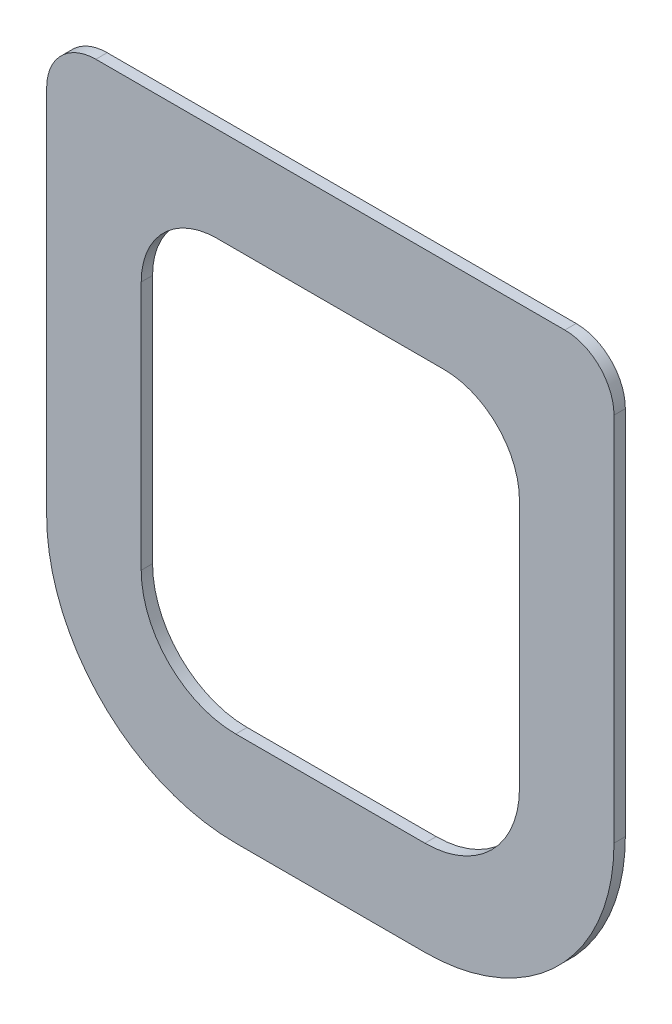
ISO-10303-21;
HEADER;
FILE_DESCRIPTION(('STEP AP214'),'2;1');
FILE_NAME('part.step','',(''),(''),'','','');
FILE_SCHEMA(('AUTOMOTIVE_DESIGN { 1 0 10303 214 1 1 1 1 }'));
ENDSEC;
DATA;
#1=APPLICATION_CONTEXT('core data for automotive mechanical design processes');
#2=APPLICATION_PROTOCOL_DEFINITION('international standard','automotive_design',2000,#1);
#3=PRODUCT_CONTEXT('',#1,'mechanical');
#4=PRODUCT('Part','Part','',(#3));
#5=PRODUCT_RELATED_PRODUCT_CATEGORY('part','',(#4));
#6=PRODUCT_DEFINITION_FORMATION('','',#4);
#7=PRODUCT_DEFINITION_CONTEXT('part definition',#1,'design');
#8=PRODUCT_DEFINITION('design','',#6,#7);
#9=PRODUCT_DEFINITION_SHAPE('','',#8);
#10=(LENGTH_UNIT() NAMED_UNIT(*) SI_UNIT(.MILLI.,.METRE.));
#11=(NAMED_UNIT(*) PLANE_ANGLE_UNIT() SI_UNIT($,.RADIAN.));
#12=(NAMED_UNIT(*) SI_UNIT($,.STERADIAN.) SOLID_ANGLE_UNIT());
#13=UNCERTAINTY_MEASURE_WITH_UNIT(LENGTH_MEASURE(1.E-05),#10,'distance_accuracy_value','');
#14=(GEOMETRIC_REPRESENTATION_CONTEXT(3) GLOBAL_UNCERTAINTY_ASSIGNED_CONTEXT((#13)) GLOBAL_UNIT_ASSIGNED_CONTEXT((#10,
#11,#12)) REPRESENTATION_CONTEXT('',''));
#15=CARTESIAN_POINT('',(0.,0.,0.));
#16=DIRECTION('',(0.,0.,1.));
#17=DIRECTION('',(1.,0.,0.));
#18=AXIS2_PLACEMENT_3D('',#15,#16,#17);
#19=CARTESIAN_POINT('',(-25.,-34.1899999999999,3.));
#20=DIRECTION('',(0.,0.,1.));
#21=DIRECTION('',(1.,0.,0.));
#22=AXIS2_PLACEMENT_3D('',#19,#20,#21);
#23=PLANE('',#22);
#24=CARTESIAN_POINT('',(-25.,-34.1899999999999,3.));
#25=DIRECTION('',(0.,0.,1.));
#26=DIRECTION('',(1.,0.,0.));
#27=AXIS2_PLACEMENT_3D('',#24,#25,#26);
#28=CIRCLE('',#27,50.);
#29=CARTESIAN_POINT('',(-75.,-34.19,3.));
#30=VERTEX_POINT('',#29);
#31=CARTESIAN_POINT('',(-25.,-84.1899999999999,3.));
#32=VERTEX_POINT('',#31);
#33=EDGE_CURVE('E198',#30,#32,#28,.T.);
#34=ORIENTED_EDGE('',*,*,#33,.T.);
#35=DIRECTION('',(1.,0.,0.));
#36=VECTOR('',#35,1.);
#37=CARTESIAN_POINT('',(-25.,-84.1899999999999,3.));
#38=LINE('',#37,#36);
#39=CARTESIAN_POINT('',(25.,-84.1899999999999,3.));
#40=VERTEX_POINT('',#39);
#41=EDGE_CURVE('E201',#32,#40,#38,.T.);
#42=ORIENTED_EDGE('',*,*,#41,.T.);
#43=CARTESIAN_POINT('',(25.,-34.19,3.));
#44=DIRECTION('',(0.,0.,1.));
#45=DIRECTION('',(1.,0.,0.));
#46=AXIS2_PLACEMENT_3D('',#43,#44,#45);
#47=CIRCLE('',#46,49.9999999999999);
#48=CARTESIAN_POINT('',(75.,-34.19,3.));
#49=VERTEX_POINT('',#48);
#50=EDGE_CURVE('E204',#40,#49,#47,.T.);
#51=ORIENTED_EDGE('',*,*,#50,.T.);
#52=DIRECTION('',(0.,1.,0.));
#53=VECTOR('',#52,1.);
#54=CARTESIAN_POINT('',(75.,-34.19,3.));
#55=LINE('',#54,#53);
#56=CARTESIAN_POINT('',(75.,63.81,3.));
#57=VERTEX_POINT('',#56);
#58=EDGE_CURVE('E206',#49,#57,#55,.T.);
#59=ORIENTED_EDGE('',*,*,#58,.T.);
#60=CARTESIAN_POINT('',(62.,63.81,3.));
#61=DIRECTION('',(0.,0.,1.));
#62=DIRECTION('',(1.,0.,0.));
#63=AXIS2_PLACEMENT_3D('',#60,#61,#62);
#64=CIRCLE('',#63,13.);
#65=CARTESIAN_POINT('',(62.,76.81,3.));
#66=VERTEX_POINT('',#65);
#67=EDGE_CURVE('E208',#57,#66,#64,.T.);
#68=ORIENTED_EDGE('',*,*,#67,.T.);
#69=DIRECTION('',(-1.,0.,0.));
#70=VECTOR('',#69,1.);
#71=CARTESIAN_POINT('',(62.,76.81,3.));
#72=LINE('',#71,#70);
#73=CARTESIAN_POINT('',(-62.,76.81,3.));
#74=VERTEX_POINT('',#73);
#75=EDGE_CURVE('E210',#66,#74,#72,.T.);
#76=ORIENTED_EDGE('',*,*,#75,.T.);
#77=CARTESIAN_POINT('',(-62.,63.81,3.));
#78=DIRECTION('',(0.,0.,1.));
#79=DIRECTION('',(-1.,0.,0.));
#80=AXIS2_PLACEMENT_3D('',#77,#78,#79);
#81=CIRCLE('',#80,13.);
#82=CARTESIAN_POINT('',(-75.,63.81,3.));
#83=VERTEX_POINT('',#82);
#84=EDGE_CURVE('E212',#74,#83,#81,.T.);
#85=ORIENTED_EDGE('',*,*,#84,.T.);
#86=DIRECTION('',(0.,-1.,0.));
#87=VECTOR('',#86,1.);
#88=CARTESIAN_POINT('',(-75.,63.81,3.));
#89=LINE('',#88,#87);
#90=EDGE_CURVE('E214',#83,#30,#89,.T.);
#91=ORIENTED_EDGE('',*,*,#90,.T.);
#92=EDGE_LOOP('',(#34,#42,#51,#59,#68,#76,#85,#91));
#93=FACE_BOUND('',#92,.T.);
#94=DIRECTION('',(-1.,0.,0.));
#95=VECTOR('',#94,1.);
#96=CARTESIAN_POINT('',(50.,51.81,3.));
#97=LINE('',#96,#95);
#98=CARTESIAN_POINT('',(30.,51.81,3.));
#99=VERTEX_POINT('',#98);
#100=CARTESIAN_POINT('',(-30.,51.81,3.));
#101=VERTEX_POINT('',#100);
#102=EDGE_CURVE('E155',#99,#101,#97,.T.);
#103=ORIENTED_EDGE('',*,*,#102,.F.);
#104=CARTESIAN_POINT('',(30.,31.81,3.));
#105=DIRECTION('',(0.,0.,1.));
#106=DIRECTION('',(1.,0.,0.));
#107=AXIS2_PLACEMENT_3D('',#104,#105,#106);
#108=CIRCLE('',#107,20.);
#109=CARTESIAN_POINT('',(50.,31.81,3.));
#110=VERTEX_POINT('',#109);
#111=EDGE_CURVE('E266',#99,#110,#108,.F.);
#112=ORIENTED_EDGE('',*,*,#111,.T.);
#113=DIRECTION('',(0.,1.,0.));
#114=VECTOR('',#113,1.);
#115=CARTESIAN_POINT('',(50.,-34.19,3.));
#116=LINE('',#115,#114);
#117=CARTESIAN_POINT('',(50.,-34.19,3.));
#118=VERTEX_POINT('',#117);
#119=EDGE_CURVE('E192',#118,#110,#116,.T.);
#120=ORIENTED_EDGE('',*,*,#119,.F.);
#121=CARTESIAN_POINT('',(25.,-34.19,3.));
#122=DIRECTION('',(0.,0.,1.));
#123=DIRECTION('',(1.,0.,0.));
#124=AXIS2_PLACEMENT_3D('',#121,#122,#123);
#125=CIRCLE('',#124,24.9999999999999);
#126=CARTESIAN_POINT('',(25.,-59.1899999999999,3.));
#127=VERTEX_POINT('',#126);
#128=EDGE_CURVE('E172',#127,#118,#125,.T.);
#129=ORIENTED_EDGE('',*,*,#128,.F.);
#130=DIRECTION('',(1.,0.,0.));
#131=VECTOR('',#130,1.);
#132=CARTESIAN_POINT('',(-25.,-59.1899999999999,3.));
#133=LINE('',#132,#131);
#134=CARTESIAN_POINT('',(-25.,-59.1899999999999,3.));
#135=VERTEX_POINT('',#134);
#136=EDGE_CURVE('E170',#135,#127,#133,.T.);
#137=ORIENTED_EDGE('',*,*,#136,.F.);
#138=CARTESIAN_POINT('',(-25.,-34.1899999999999,3.));
#139=DIRECTION('',(0.,0.,1.));
#140=DIRECTION('',(1.,0.,0.));
#141=AXIS2_PLACEMENT_3D('',#138,#139,#140);
#142=CIRCLE('',#141,25.);
#143=CARTESIAN_POINT('',(-50.,-34.19,3.));
#144=VERTEX_POINT('',#143);
#145=EDGE_CURVE('E154',#144,#135,#142,.T.);
#146=ORIENTED_EDGE('',*,*,#145,.F.);
#147=DIRECTION('',(0.,-1.,0.));
#148=VECTOR('',#147,1.);
#149=CARTESIAN_POINT('',(-50.,51.81,3.));
#150=LINE('',#149,#148);
#151=CARTESIAN_POINT('',(-50.,31.81,3.));
#152=VERTEX_POINT('',#151);
#153=EDGE_CURVE('E146',#152,#144,#150,.T.);
#154=ORIENTED_EDGE('',*,*,#153,.F.);
#155=CARTESIAN_POINT('',(-30.,31.81,3.));
#156=DIRECTION('',(0.,0.,1.));
#157=DIRECTION('',(1.,0.,0.));
#158=AXIS2_PLACEMENT_3D('',#155,#156,#157);
#159=CIRCLE('',#158,20.);
#160=EDGE_CURVE('E11',#152,#101,#159,.F.);
#161=ORIENTED_EDGE('',*,*,#160,.T.);
#162=EDGE_LOOP('',(#103,#112,#120,#129,#137,#146,#154,#161));
#163=FACE_BOUND('',#162,.T.);
#164=ADVANCED_FACE('F37',(#93,#163),#23,.T.);
#165=CARTESIAN_POINT('',(-25.,-34.1899999999999,0.));
#166=DIRECTION('',(0.,0.,1.));
#167=DIRECTION('',(1.,0.,0.));
#168=AXIS2_PLACEMENT_3D('',#165,#166,#167);
#169=PLANE('',#168);
#170=CARTESIAN_POINT('',(-25.,-34.1899999999999,0.));
#171=DIRECTION('',(0.,0.,1.));
#172=DIRECTION('',(1.,0.,0.));
#173=AXIS2_PLACEMENT_3D('',#170,#171,#172);
#174=CIRCLE('',#173,50.);
#175=CARTESIAN_POINT('',(-75.,-34.19,0.));
#176=VERTEX_POINT('',#175);
#177=CARTESIAN_POINT('',(-25.,-84.1899999999999,0.));
#178=VERTEX_POINT('',#177);
#179=EDGE_CURVE('E163',#176,#178,#174,.T.);
#180=ORIENTED_EDGE('',*,*,#179,.F.);
#181=DIRECTION('',(0.,-1.,0.));
#182=VECTOR('',#181,1.);
#183=CARTESIAN_POINT('',(-75.,63.81,0.));
#184=LINE('',#183,#182);
#185=CARTESIAN_POINT('',(-75.,63.81,0.));
#186=VERTEX_POINT('',#185);
#187=EDGE_CURVE('E202',#186,#176,#184,.T.);
#188=ORIENTED_EDGE('',*,*,#187,.F.);
#189=CARTESIAN_POINT('',(-62.,63.81,0.));
#190=DIRECTION('',(0.,0.,1.));
#191=DIRECTION('',(-1.,0.,0.));
#192=AXIS2_PLACEMENT_3D('',#189,#190,#191);
#193=CIRCLE('',#192,13.);
#194=CARTESIAN_POINT('',(-62.,76.81,0.));
#195=VERTEX_POINT('',#194);
#196=EDGE_CURVE('E229',#195,#186,#193,.T.);
#197=ORIENTED_EDGE('',*,*,#196,.F.);
#198=DIRECTION('',(-1.,0.,0.));
#199=VECTOR('',#198,1.);
#200=CARTESIAN_POINT('',(62.,76.81,0.));
#201=LINE('',#200,#199);
#202=CARTESIAN_POINT('',(62.,76.81,0.));
#203=VERTEX_POINT('',#202);
#204=EDGE_CURVE('E227',#203,#195,#201,.T.);
#205=ORIENTED_EDGE('',*,*,#204,.F.);
#206=CARTESIAN_POINT('',(62.,63.81,0.));
#207=DIRECTION('',(0.,0.,1.));
#208=DIRECTION('',(1.,0.,0.));
#209=AXIS2_PLACEMENT_3D('',#206,#207,#208);
#210=CIRCLE('',#209,13.);
#211=CARTESIAN_POINT('',(75.,63.81,0.));
#212=VERTEX_POINT('',#211);
#213=EDGE_CURVE('E225',#212,#203,#210,.T.);
#214=ORIENTED_EDGE('',*,*,#213,.F.);
#215=DIRECTION('',(0.,1.,0.));
#216=VECTOR('',#215,1.);
#217=CARTESIAN_POINT('',(75.,-34.19,0.));
#218=LINE('',#217,#216);
#219=CARTESIAN_POINT('',(75.,-34.19,0.));
#220=VERTEX_POINT('',#219);
#221=EDGE_CURVE('E223',#220,#212,#218,.T.);
#222=ORIENTED_EDGE('',*,*,#221,.F.);
#223=CARTESIAN_POINT('',(25.,-34.19,0.));
#224=DIRECTION('',(0.,0.,1.));
#225=DIRECTION('',(1.,0.,0.));
#226=AXIS2_PLACEMENT_3D('',#223,#224,#225);
#227=CIRCLE('',#226,49.9999999999999);
#228=CARTESIAN_POINT('',(25.,-84.1899999999999,0.));
#229=VERTEX_POINT('',#228);
#230=EDGE_CURVE('E221',#229,#220,#227,.T.);
#231=ORIENTED_EDGE('',*,*,#230,.F.);
#232=DIRECTION('',(1.,0.,0.));
#233=VECTOR('',#232,1.);
#234=CARTESIAN_POINT('',(0.500000000000046,-84.1899999999999,0.));
#235=LINE('',#234,#233);
#236=EDGE_CURVE('E219',#178,#229,#235,.T.);
#237=ORIENTED_EDGE('',*,*,#236,.F.);
#238=EDGE_LOOP('',(#180,#188,#197,#205,#214,#222,#231,#237));
#239=FACE_BOUND('',#238,.T.);
#240=DIRECTION('',(0.,1.,0.));
#241=VECTOR('',#240,1.);
#242=CARTESIAN_POINT('',(50.,-34.19,0.));
#243=LINE('',#242,#241);
#244=CARTESIAN_POINT('',(50.,-34.19,0.));
#245=VERTEX_POINT('',#244);
#246=CARTESIAN_POINT('',(50.,31.81,0.));
#247=VERTEX_POINT('',#246);
#248=EDGE_CURVE('E178',#245,#247,#243,.T.);
#249=ORIENTED_EDGE('',*,*,#248,.T.);
#250=CARTESIAN_POINT('',(30.,31.81,0.));
#251=DIRECTION('',(0.,0.,1.));
#252=DIRECTION('',(1.,0.,0.));
#253=AXIS2_PLACEMENT_3D('',#250,#251,#252);
#254=CIRCLE('',#253,20.);
#255=CARTESIAN_POINT('',(30.,51.81,0.));
#256=VERTEX_POINT('',#255);
#257=EDGE_CURVE('E264',#247,#256,#254,.T.);
#258=ORIENTED_EDGE('',*,*,#257,.T.);
#259=DIRECTION('',(-1.,0.,0.));
#260=VECTOR('',#259,1.);
#261=CARTESIAN_POINT('',(50.,51.81,0.));
#262=LINE('',#261,#260);
#263=CARTESIAN_POINT('',(-30.,51.81,0.));
#264=VERTEX_POINT('',#263);
#265=EDGE_CURVE('E181',#256,#264,#262,.T.);
#266=ORIENTED_EDGE('',*,*,#265,.T.);
#267=CARTESIAN_POINT('',(-30.,31.81,0.));
#268=DIRECTION('',(0.,0.,1.));
#269=DIRECTION('',(1.,0.,0.));
#270=AXIS2_PLACEMENT_3D('',#267,#268,#269);
#271=CIRCLE('',#270,20.);
#272=CARTESIAN_POINT('',(-50.,31.81,0.));
#273=VERTEX_POINT('',#272);
#274=EDGE_CURVE('E45',#264,#273,#271,.T.);
#275=ORIENTED_EDGE('',*,*,#274,.T.);
#276=DIRECTION('',(0.,-1.,0.));
#277=VECTOR('',#276,1.);
#278=CARTESIAN_POINT('',(-50.,51.81,0.));
#279=LINE('',#278,#277);
#280=CARTESIAN_POINT('',(-50.,-34.19,0.));
#281=VERTEX_POINT('',#280);
#282=EDGE_CURVE('E183',#273,#281,#279,.T.);
#283=ORIENTED_EDGE('',*,*,#282,.T.);
#284=CARTESIAN_POINT('',(-25.,-34.1899999999999,0.));
#285=DIRECTION('',(0.,0.,1.));
#286=DIRECTION('',(1.,0.,0.));
#287=AXIS2_PLACEMENT_3D('',#284,#285,#286);
#288=CIRCLE('',#287,25.);
#289=CARTESIAN_POINT('',(-25.,-59.1899999999999,0.));
#290=VERTEX_POINT('',#289);
#291=EDGE_CURVE('E162',#281,#290,#288,.T.);
#292=ORIENTED_EDGE('',*,*,#291,.T.);
#293=DIRECTION('',(1.,0.,0.));
#294=VECTOR('',#293,1.);
#295=CARTESIAN_POINT('',(0.500000000000046,-59.1899999999999,0.));
#296=LINE('',#295,#294);
#297=CARTESIAN_POINT('',(25.,-59.1899999999999,0.));
#298=VERTEX_POINT('',#297);
#299=EDGE_CURVE('E186',#290,#298,#296,.T.);
#300=ORIENTED_EDGE('',*,*,#299,.T.);
#301=CARTESIAN_POINT('',(25.,-34.19,0.));
#302=DIRECTION('',(0.,0.,1.));
#303=DIRECTION('',(1.,0.,0.));
#304=AXIS2_PLACEMENT_3D('',#301,#302,#303);
#305=CIRCLE('',#304,24.9999999999999);
#306=EDGE_CURVE('E189',#298,#245,#305,.T.);
#307=ORIENTED_EDGE('',*,*,#306,.T.);
#308=EDGE_LOOP('',(#249,#258,#266,#275,#283,#292,#300,#307));
#309=FACE_BOUND('',#308,.T.);
#310=ADVANCED_FACE('F280',(#239,#309),#169,.F.);
#311=CARTESIAN_POINT('',(-25.,-34.1899999999999,3.));
#312=DIRECTION('',(0.,0.,-1.));
#313=DIRECTION('',(-1.,0.,0.));
#314=AXIS2_PLACEMENT_3D('',#311,#312,#313);
#315=CYLINDRICAL_SURFACE('',#314,50.);
#316=ORIENTED_EDGE('',*,*,#179,.T.);
#317=DIRECTION('',(0.,0.,-1.));
#318=VECTOR('',#317,1.);
#319=CARTESIAN_POINT('',(-25.,-84.1899999999999,3.));
#320=LINE('',#319,#318);
#321=EDGE_CURVE('E252',#32,#178,#320,.T.);
#322=ORIENTED_EDGE('',*,*,#321,.F.);
#323=ORIENTED_EDGE('',*,*,#33,.F.);
#324=DIRECTION('',(0.,0.,-1.));
#325=VECTOR('',#324,1.);
#326=CARTESIAN_POINT('',(-75.,-34.19,3.));
#327=LINE('',#326,#325);
#328=EDGE_CURVE('E216',#30,#176,#327,.T.);
#329=ORIENTED_EDGE('',*,*,#328,.T.);
#330=EDGE_LOOP('',(#316,#322,#323,#329));
#331=FACE_BOUND('',#330,.T.);
#332=ADVANCED_FACE('F296',(#331),#315,.T.);
#333=CARTESIAN_POINT('',(0.500000000000046,-84.1899999999999,3.));
#334=DIRECTION('',(0.,1.,0.));
#335=DIRECTION('',(0.,0.,1.));
#336=AXIS2_PLACEMENT_3D('',#333,#334,#335);
#337=PLANE('',#336);
#338=ORIENTED_EDGE('',*,*,#236,.T.);
#339=DIRECTION('',(0.,0.,-1.));
#340=VECTOR('',#339,1.);
#341=CARTESIAN_POINT('',(25.,-84.1899999999999,3.));
#342=LINE('',#341,#340);
#343=EDGE_CURVE('E249',#40,#229,#342,.T.);
#344=ORIENTED_EDGE('',*,*,#343,.F.);
#345=ORIENTED_EDGE('',*,*,#41,.F.);
#346=ORIENTED_EDGE('',*,*,#321,.T.);
#347=EDGE_LOOP('',(#338,#344,#345,#346));
#348=FACE_BOUND('',#347,.T.);
#349=ADVANCED_FACE('F325',(#348),#337,.F.);
#350=CARTESIAN_POINT('',(25.,-34.19,3.));
#351=DIRECTION('',(0.,0.,-1.));
#352=DIRECTION('',(-1.,0.,0.));
#353=AXIS2_PLACEMENT_3D('',#350,#351,#352);
#354=CYLINDRICAL_SURFACE('',#353,49.9999999999999);
#355=ORIENTED_EDGE('',*,*,#230,.T.);
#356=DIRECTION('',(0.,0.,-1.));
#357=VECTOR('',#356,1.);
#358=CARTESIAN_POINT('',(75.,-34.19,3.));
#359=LINE('',#358,#357);
#360=EDGE_CURVE('E246',#49,#220,#359,.T.);
#361=ORIENTED_EDGE('',*,*,#360,.F.);
#362=ORIENTED_EDGE('',*,*,#50,.F.);
#363=ORIENTED_EDGE('',*,*,#343,.T.);
#364=EDGE_LOOP('',(#355,#361,#362,#363));
#365=FACE_BOUND('',#364,.T.);
#366=ADVANCED_FACE('F321',(#365),#354,.T.);
#367=CARTESIAN_POINT('',(75.,-34.19,3.));
#368=DIRECTION('',(-1.,0.,0.));
#369=DIRECTION('',(0.,0.,1.));
#370=AXIS2_PLACEMENT_3D('',#367,#368,#369);
#371=PLANE('',#370);
#372=ORIENTED_EDGE('',*,*,#221,.T.);
#373=DIRECTION('',(0.,0.,-1.));
#374=VECTOR('',#373,1.);
#375=CARTESIAN_POINT('',(75.,63.81,3.));
#376=LINE('',#375,#374);
#377=EDGE_CURVE('E243',#57,#212,#376,.T.);
#378=ORIENTED_EDGE('',*,*,#377,.F.);
#379=ORIENTED_EDGE('',*,*,#58,.F.);
#380=ORIENTED_EDGE('',*,*,#360,.T.);
#381=EDGE_LOOP('',(#372,#378,#379,#380));
#382=FACE_BOUND('',#381,.T.);
#383=ADVANCED_FACE('F317',(#382),#371,.F.);
#384=CARTESIAN_POINT('',(62.,63.81,3.));
#385=DIRECTION('',(0.,0.,-1.));
#386=DIRECTION('',(-1.,0.,0.));
#387=AXIS2_PLACEMENT_3D('',#384,#385,#386);
#388=CYLINDRICAL_SURFACE('',#387,13.);
#389=ORIENTED_EDGE('',*,*,#213,.T.);
#390=DIRECTION('',(0.,0.,-1.));
#391=VECTOR('',#390,1.);
#392=CARTESIAN_POINT('',(62.,76.81,3.));
#393=LINE('',#392,#391);
#394=EDGE_CURVE('E240',#66,#203,#393,.T.);
#395=ORIENTED_EDGE('',*,*,#394,.F.);
#396=ORIENTED_EDGE('',*,*,#67,.F.);
#397=ORIENTED_EDGE('',*,*,#377,.T.);
#398=EDGE_LOOP('',(#389,#395,#396,#397));
#399=FACE_BOUND('',#398,.T.);
#400=ADVANCED_FACE('F313',(#399),#388,.T.);
#401=CARTESIAN_POINT('',(62.,76.81,3.));
#402=DIRECTION('',(0.,-1.,0.));
#403=DIRECTION('',(0.,0.,-1.));
#404=AXIS2_PLACEMENT_3D('',#401,#402,#403);
#405=PLANE('',#404);
#406=ORIENTED_EDGE('',*,*,#204,.T.);
#407=DIRECTION('',(0.,0.,-1.));
#408=VECTOR('',#407,1.);
#409=CARTESIAN_POINT('',(-62.,76.81,3.));
#410=LINE('',#409,#408);
#411=EDGE_CURVE('E237',#74,#195,#410,.T.);
#412=ORIENTED_EDGE('',*,*,#411,.F.);
#413=ORIENTED_EDGE('',*,*,#75,.F.);
#414=ORIENTED_EDGE('',*,*,#394,.T.);
#415=EDGE_LOOP('',(#406,#412,#413,#414));
#416=FACE_BOUND('',#415,.T.);
#417=ADVANCED_FACE('F309',(#416),#405,.F.);
#418=CARTESIAN_POINT('',(-62.,63.81,3.));
#419=DIRECTION('',(0.,0.,-1.));
#420=DIRECTION('',(-1.,0.,0.));
#421=AXIS2_PLACEMENT_3D('',#418,#419,#420);
#422=CYLINDRICAL_SURFACE('',#421,13.);
#423=ORIENTED_EDGE('',*,*,#196,.T.);
#424=DIRECTION('',(0.,0.,-1.));
#425=VECTOR('',#424,1.);
#426=CARTESIAN_POINT('',(-75.,63.81,3.));
#427=LINE('',#426,#425);
#428=EDGE_CURVE('E234',#83,#186,#427,.T.);
#429=ORIENTED_EDGE('',*,*,#428,.F.);
#430=ORIENTED_EDGE('',*,*,#84,.F.);
#431=ORIENTED_EDGE('',*,*,#411,.T.);
#432=EDGE_LOOP('',(#423,#429,#430,#431));
#433=FACE_BOUND('',#432,.T.);
#434=ADVANCED_FACE('F305',(#433),#422,.T.);
#435=CARTESIAN_POINT('',(-75.,63.81,3.));
#436=DIRECTION('',(1.,0.,0.));
#437=DIRECTION('',(0.,0.,-1.));
#438=AXIS2_PLACEMENT_3D('',#435,#436,#437);
#439=PLANE('',#438);
#440=ORIENTED_EDGE('',*,*,#187,.T.);
#441=ORIENTED_EDGE('',*,*,#328,.F.);
#442=ORIENTED_EDGE('',*,*,#90,.F.);
#443=ORIENTED_EDGE('',*,*,#428,.T.);
#444=EDGE_LOOP('',(#440,#441,#442,#443));
#445=FACE_BOUND('',#444,.T.);
#446=ADVANCED_FACE('F302',(#445),#439,.F.);
#447=CARTESIAN_POINT('',(50.,-34.19,3.));
#448=DIRECTION('',(-1.,0.,0.));
#449=DIRECTION('',(0.,0.,1.));
#450=AXIS2_PLACEMENT_3D('',#447,#448,#449);
#451=PLANE('',#450);
#452=ORIENTED_EDGE('',*,*,#119,.T.);
#453=DIRECTION('',(0.,0.,-1.));
#454=VECTOR('',#453,1.);
#455=CARTESIAN_POINT('',(50.,31.81,0.));
#456=LINE('',#455,#454);
#457=EDGE_CURVE('E255',#110,#247,#456,.T.);
#458=ORIENTED_EDGE('',*,*,#457,.T.);
#459=ORIENTED_EDGE('',*,*,#248,.F.);
#460=DIRECTION('',(0.,0.,-1.));
#461=VECTOR('',#460,1.);
#462=CARTESIAN_POINT('',(50.,-34.19,3.));
#463=LINE('',#462,#461);
#464=EDGE_CURVE('E177',#118,#245,#463,.T.);
#465=ORIENTED_EDGE('',*,*,#464,.F.);
#466=EDGE_LOOP('',(#452,#458,#459,#465));
#467=FACE_BOUND('',#466,.T.);
#468=ADVANCED_FACE('F276',(#467),#451,.T.);
#469=CARTESIAN_POINT('',(50.,51.81,3.));
#470=DIRECTION('',(0.,-1.,0.));
#471=DIRECTION('',(1.,0.,0.));
#472=AXIS2_PLACEMENT_3D('',#469,#470,#471);
#473=PLANE('',#472);
#474=ORIENTED_EDGE('',*,*,#265,.F.);
#475=DIRECTION('',(0.,0.,-1.));
#476=VECTOR('',#475,1.);
#477=CARTESIAN_POINT('',(30.,51.81,3.));
#478=LINE('',#477,#476);
#479=EDGE_CURVE('E261',#256,#99,#478,.F.);
#480=ORIENTED_EDGE('',*,*,#479,.T.);
#481=ORIENTED_EDGE('',*,*,#102,.T.);
#482=DIRECTION('',(0.,0.,-1.));
#483=VECTOR('',#482,1.);
#484=CARTESIAN_POINT('',(-30.,51.81,0.));
#485=LINE('',#484,#483);
#486=EDGE_CURVE('E258',#101,#264,#485,.T.);
#487=ORIENTED_EDGE('',*,*,#486,.T.);
#488=EDGE_LOOP('',(#474,#480,#481,#487));
#489=FACE_BOUND('',#488,.T.);
#490=ADVANCED_FACE('F282',(#489),#473,.T.);
#491=CARTESIAN_POINT('',(-50.,51.81,3.));
#492=DIRECTION('',(1.,0.,0.));
#493=DIRECTION('',(0.,1.,0.));
#494=AXIS2_PLACEMENT_3D('',#491,#492,#493);
#495=PLANE('',#494);
#496=ORIENTED_EDGE('',*,*,#282,.F.);
#497=DIRECTION('',(0.,0.,-1.));
#498=VECTOR('',#497,1.);
#499=CARTESIAN_POINT('',(-50.,31.81,3.));
#500=LINE('',#499,#498);
#501=EDGE_CURVE('E52',#273,#152,#500,.F.);
#502=ORIENTED_EDGE('',*,*,#501,.T.);
#503=ORIENTED_EDGE('',*,*,#153,.T.);
#504=DIRECTION('',(0.,0.,-1.));
#505=VECTOR('',#504,1.);
#506=CARTESIAN_POINT('',(-50.,-34.19,3.));
#507=LINE('',#506,#505);
#508=EDGE_CURVE('E149',#144,#281,#507,.T.);
#509=ORIENTED_EDGE('',*,*,#508,.T.);
#510=EDGE_LOOP('',(#496,#502,#503,#509));
#511=FACE_BOUND('',#510,.T.);
#512=ADVANCED_FACE('F148',(#511),#495,.T.);
#513=CARTESIAN_POINT('',(-25.,-34.1899999999999,3.));
#514=DIRECTION('',(0.,0.,-1.));
#515=DIRECTION('',(-1.,0.,0.));
#516=AXIS2_PLACEMENT_3D('',#513,#514,#515);
#517=CYLINDRICAL_SURFACE('',#516,25.);
#518=ORIENTED_EDGE('',*,*,#291,.F.);
#519=ORIENTED_EDGE('',*,*,#508,.F.);
#520=ORIENTED_EDGE('',*,*,#145,.T.);
#521=DIRECTION('',(0.,0.,-1.));
#522=VECTOR('',#521,1.);
#523=CARTESIAN_POINT('',(-25.,-59.1899999999999,3.));
#524=LINE('',#523,#522);
#525=EDGE_CURVE('E164',#135,#290,#524,.T.);
#526=ORIENTED_EDGE('',*,*,#525,.T.);
#527=EDGE_LOOP('',(#518,#519,#520,#526));
#528=FACE_BOUND('',#527,.T.);
#529=ADVANCED_FACE('F158',(#528),#517,.F.);
#530=CARTESIAN_POINT('',(0.500000000000046,-59.1899999999999,3.));
#531=DIRECTION('',(0.,1.,0.));
#532=DIRECTION('',(0.,0.,1.));
#533=AXIS2_PLACEMENT_3D('',#530,#531,#532);
#534=PLANE('',#533);
#535=ORIENTED_EDGE('',*,*,#299,.F.);
#536=ORIENTED_EDGE('',*,*,#525,.F.);
#537=ORIENTED_EDGE('',*,*,#136,.T.);
#538=DIRECTION('',(0.,0.,-1.));
#539=VECTOR('',#538,1.);
#540=CARTESIAN_POINT('',(25.,-59.1899999999999,3.));
#541=LINE('',#540,#539);
#542=EDGE_CURVE('E195',#127,#298,#541,.T.);
#543=ORIENTED_EDGE('',*,*,#542,.T.);
#544=EDGE_LOOP('',(#535,#536,#537,#543));
#545=FACE_BOUND('',#544,.T.);
#546=ADVANCED_FACE('F409',(#545),#534,.T.);
#547=CARTESIAN_POINT('',(25.,-34.19,3.));
#548=DIRECTION('',(0.,0.,-1.));
#549=DIRECTION('',(-1.,0.,0.));
#550=AXIS2_PLACEMENT_3D('',#547,#548,#549);
#551=CYLINDRICAL_SURFACE('',#550,24.9999999999999);
#552=ORIENTED_EDGE('',*,*,#306,.F.);
#553=ORIENTED_EDGE('',*,*,#542,.F.);
#554=ORIENTED_EDGE('',*,*,#128,.T.);
#555=ORIENTED_EDGE('',*,*,#464,.T.);
#556=EDGE_LOOP('',(#552,#553,#554,#555));
#557=FACE_BOUND('',#556,.T.);
#558=ADVANCED_FACE('F289',(#557),#551,.F.);
#559=CARTESIAN_POINT('',(30.,31.81,3.));
#560=DIRECTION('',(0.,0.,1.));
#561=DIRECTION('',(1.,0.,0.));
#562=AXIS2_PLACEMENT_3D('',#559,#560,#561);
#563=CYLINDRICAL_SURFACE('',#562,20.);
#564=ORIENTED_EDGE('',*,*,#111,.F.);
#565=ORIENTED_EDGE('',*,*,#479,.F.);
#566=ORIENTED_EDGE('',*,*,#257,.F.);
#567=ORIENTED_EDGE('',*,*,#457,.F.);
#568=EDGE_LOOP('',(#564,#565,#566,#567));
#569=FACE_BOUND('',#568,.T.);
#570=ADVANCED_FACE('F278',(#569),#563,.F.);
#571=CARTESIAN_POINT('',(-30.,31.81,3.));
#572=DIRECTION('',(0.,0.,1.));
#573=DIRECTION('',(1.,0.,0.));
#574=AXIS2_PLACEMENT_3D('',#571,#572,#573);
#575=CYLINDRICAL_SURFACE('',#574,20.);
#576=ORIENTED_EDGE('',*,*,#160,.F.);
#577=ORIENTED_EDGE('',*,*,#501,.F.);
#578=ORIENTED_EDGE('',*,*,#274,.F.);
#579=ORIENTED_EDGE('',*,*,#486,.F.);
#580=EDGE_LOOP('',(#576,#577,#578,#579));
#581=FACE_BOUND('',#580,.T.);
#582=ADVANCED_FACE('F39',(#581),#575,.F.);
#583=CLOSED_SHELL('',(#164,#310,#332,#349,#366,#383,#400,#417,#434,#446,#468,#490,#512,#529,
#546,#558,#570,#582));
#584=MANIFOLD_SOLID_BREP('B2',#583);
#585=ADVANCED_BREP_SHAPE_REPRESENTATION('',(#18,#584),#14);
#586=SHAPE_DEFINITION_REPRESENTATION(#9,#585);
ENDSEC;
END-ISO-10303-21;
